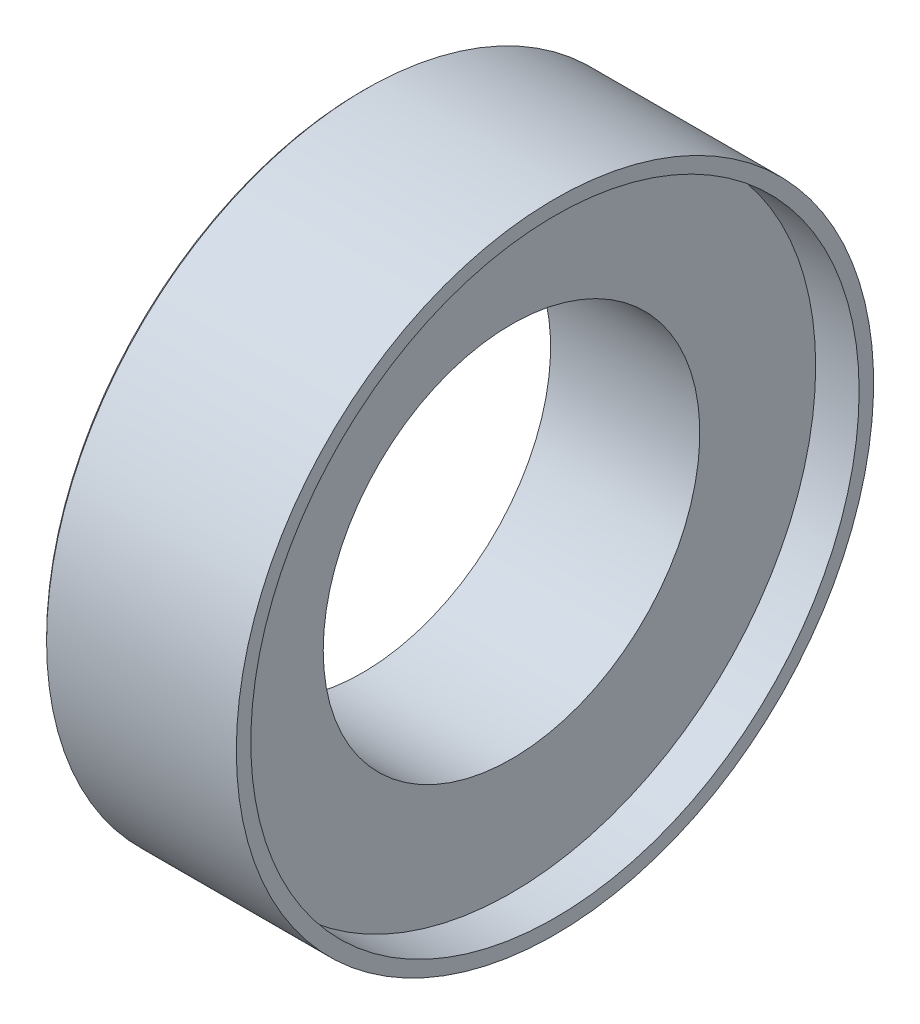
ISO-10303-21;
HEADER;
FILE_DESCRIPTION(('STEP AP214'),'2;1');
FILE_NAME('part.step','',(''),(''),'','','');
FILE_SCHEMA(('AUTOMOTIVE_DESIGN { 1 0 10303 214 1 1 1 1 }'));
ENDSEC;
DATA;
#1=APPLICATION_CONTEXT('core data for automotive mechanical design processes');
#2=APPLICATION_PROTOCOL_DEFINITION('international standard','automotive_design',2000,#1);
#3=PRODUCT_CONTEXT('',#1,'mechanical');
#4=PRODUCT('Part','Part','',(#3));
#5=PRODUCT_RELATED_PRODUCT_CATEGORY('part','',(#4));
#6=PRODUCT_DEFINITION_FORMATION('','',#4);
#7=PRODUCT_DEFINITION_CONTEXT('part definition',#1,'design');
#8=PRODUCT_DEFINITION('design','',#6,#7);
#9=PRODUCT_DEFINITION_SHAPE('','',#8);
#10=(LENGTH_UNIT() NAMED_UNIT(*) SI_UNIT(.MILLI.,.METRE.));
#11=(NAMED_UNIT(*) PLANE_ANGLE_UNIT() SI_UNIT($,.RADIAN.));
#12=(NAMED_UNIT(*) SI_UNIT($,.STERADIAN.) SOLID_ANGLE_UNIT());
#13=UNCERTAINTY_MEASURE_WITH_UNIT(LENGTH_MEASURE(1.E-05),#10,'distance_accuracy_value','');
#14=(GEOMETRIC_REPRESENTATION_CONTEXT(3) GLOBAL_UNCERTAINTY_ASSIGNED_CONTEXT((#13)) GLOBAL_UNIT_ASSIGNED_CONTEXT((#10,
#11,#12)) REPRESENTATION_CONTEXT('',''));
#15=CARTESIAN_POINT('',(0.,0.,0.));
#16=DIRECTION('',(0.,0.,1.));
#17=DIRECTION('',(1.,0.,0.));
#18=AXIS2_PLACEMENT_3D('',#15,#16,#17);
#19=CARTESIAN_POINT('',(27.9,0.,10.75));
#20=DIRECTION('',(1.,0.,0.));
#21=DIRECTION('',(0.,0.,-1.));
#22=AXIS2_PLACEMENT_3D('',#19,#20,#21);
#23=PLANE('',#22);
#24=CARTESIAN_POINT('',(27.9,0.,0.));
#25=DIRECTION('',(-1.,0.,0.));
#26=DIRECTION('',(0.,0.,1.));
#27=AXIS2_PLACEMENT_3D('',#24,#25,#26);
#28=CIRCLE('',#27,11.);
#29=CARTESIAN_POINT('',(27.9,0.,11.));
#30=VERTEX_POINT('',#29);
#31=EDGE_CURVE('E36',#30,#30,#28,.T.);
#32=ORIENTED_EDGE('',*,*,#31,.F.);
#33=EDGE_LOOP('',(#32));
#34=FACE_BOUND('',#33,.T.);
#35=CARTESIAN_POINT('',(27.9,0.,0.));
#36=DIRECTION('',(1.,0.,0.));
#37=DIRECTION('',(0.,0.,-1.));
#38=AXIS2_PLACEMENT_3D('',#35,#36,#37);
#39=CIRCLE('',#38,10.5);
#40=CARTESIAN_POINT('',(27.9,0.,-10.5));
#41=VERTEX_POINT('',#40);
#42=EDGE_CURVE('E18',#41,#41,#39,.F.);
#43=ORIENTED_EDGE('',*,*,#42,.T.);
#44=EDGE_LOOP('',(#43));
#45=FACE_BOUND('',#44,.T.);
#46=ADVANCED_FACE('F15',(#34,#45),#23,.T.);
#47=CARTESIAN_POINT('',(27.15,0.,0.));
#48=DIRECTION('',(1.,0.,0.));
#49=DIRECTION('',(0.,0.,-1.));
#50=AXIS2_PLACEMENT_3D('',#47,#48,#49);
#51=CYLINDRICAL_SURFACE('',#50,10.5);
#52=CARTESIAN_POINT('',(26.4,0.,0.));
#53=DIRECTION('',(1.,0.,0.));
#54=DIRECTION('',(0.,0.,-1.));
#55=AXIS2_PLACEMENT_3D('',#52,#53,#54);
#56=CIRCLE('',#55,10.5);
#57=CARTESIAN_POINT('',(26.4,0.,-10.5));
#58=VERTEX_POINT('',#57);
#59=EDGE_CURVE('E34',#58,#58,#56,.T.);
#60=ORIENTED_EDGE('',*,*,#59,.F.);
#61=EDGE_LOOP('',(#60));
#62=FACE_BOUND('',#61,.T.);
#63=ORIENTED_EDGE('',*,*,#42,.F.);
#64=EDGE_LOOP('',(#63));
#65=FACE_BOUND('',#64,.T.);
#66=ADVANCED_FACE('F44',(#62,#65),#51,.F.);
#67=CARTESIAN_POINT('',(23.825,0.,0.));
#68=DIRECTION('',(-1.,0.,0.));
#69=DIRECTION('',(0.,0.,1.));
#70=AXIS2_PLACEMENT_3D('',#67,#68,#69);
#71=CYLINDRICAL_SURFACE('',#70,11.);
#72=CARTESIAN_POINT('',(21.35,0.,0.));
#73=DIRECTION('',(1.,0.,0.));
#74=DIRECTION('',(0.,0.,1.));
#75=AXIS2_PLACEMENT_3D('',#72,#73,#74);
#76=CIRCLE('',#75,11.);
#77=CARTESIAN_POINT('',(21.35,0.,11.));
#78=VERTEX_POINT('',#77);
#79=EDGE_CURVE('E30',#78,#78,#76,.F.);
#80=ORIENTED_EDGE('',*,*,#79,.F.);
#81=EDGE_LOOP('',(#80));
#82=FACE_BOUND('',#81,.T.);
#83=ORIENTED_EDGE('',*,*,#31,.T.);
#84=EDGE_LOOP('',(#83));
#85=FACE_BOUND('',#84,.T.);
#86=ADVANCED_FACE('F46',(#82,#85),#71,.T.);
#87=CARTESIAN_POINT('',(26.4,0.,8.75));
#88=DIRECTION('',(1.,0.,0.));
#89=DIRECTION('',(0.,0.,-1.));
#90=AXIS2_PLACEMENT_3D('',#87,#88,#89);
#91=PLANE('',#90);
#92=CARTESIAN_POINT('',(26.4,0.,0.));
#93=DIRECTION('',(-1.,0.,0.));
#94=DIRECTION('',(0.,0.,1.));
#95=AXIS2_PLACEMENT_3D('',#92,#93,#94);
#96=CIRCLE('',#95,6.5);
#97=CARTESIAN_POINT('',(26.4,0.,6.5));
#98=VERTEX_POINT('',#97);
#99=EDGE_CURVE('E27',#98,#98,#96,.T.);
#100=ORIENTED_EDGE('',*,*,#99,.T.);
#101=EDGE_LOOP('',(#100));
#102=FACE_BOUND('',#101,.T.);
#103=ORIENTED_EDGE('',*,*,#59,.T.);
#104=EDGE_LOOP('',(#103));
#105=FACE_BOUND('',#104,.T.);
#106=ADVANCED_FACE('F53',(#102,#105),#91,.T.);
#107=CARTESIAN_POINT('',(21.35,0.,0.));
#108=DIRECTION('',(1.,0.,0.));
#109=DIRECTION('',(0.,0.,-1.));
#110=AXIS2_PLACEMENT_3D('',#107,#108,#109);
#111=CONICAL_SURFACE('',#110,11.,0.785398163397448);
#112=CARTESIAN_POINT('',(21.25,0.,0.));
#113=DIRECTION('',(1.,0.,0.));
#114=DIRECTION('',(0.,0.,-1.));
#115=AXIS2_PLACEMENT_3D('',#112,#113,#114);
#116=CIRCLE('',#115,10.9);
#117=CARTESIAN_POINT('',(21.25,0.,-10.9));
#118=VERTEX_POINT('',#117);
#119=EDGE_CURVE('E22',#118,#118,#116,.F.);
#120=ORIENTED_EDGE('',*,*,#119,.F.);
#121=EDGE_LOOP('',(#120));
#122=FACE_BOUND('',#121,.T.);
#123=ORIENTED_EDGE('',*,*,#79,.T.);
#124=EDGE_LOOP('',(#123));
#125=FACE_BOUND('',#124,.T.);
#126=ADVANCED_FACE('F65',(#122,#125),#111,.T.);
#127=CARTESIAN_POINT('',(23.825,0.,0.));
#128=DIRECTION('',(-1.,0.,0.));
#129=DIRECTION('',(0.,0.,1.));
#130=AXIS2_PLACEMENT_3D('',#127,#128,#129);
#131=CYLINDRICAL_SURFACE('',#130,6.5);
#132=ORIENTED_EDGE('',*,*,#99,.F.);
#133=EDGE_LOOP('',(#132));
#134=FACE_BOUND('',#133,.T.);
#135=CARTESIAN_POINT('',(21.25,0.,0.));
#136=DIRECTION('',(-1.,0.,0.));
#137=DIRECTION('',(0.,0.,1.));
#138=AXIS2_PLACEMENT_3D('',#135,#136,#137);
#139=CIRCLE('',#138,6.5);
#140=CARTESIAN_POINT('',(21.25,0.,6.5));
#141=VERTEX_POINT('',#140);
#142=EDGE_CURVE('E10',#141,#141,#139,.F.);
#143=ORIENTED_EDGE('',*,*,#142,.F.);
#144=EDGE_LOOP('',(#143));
#145=FACE_BOUND('',#144,.T.);
#146=ADVANCED_FACE('F60',(#134,#145),#131,.F.);
#147=CARTESIAN_POINT('',(21.25,0.,8.75));
#148=DIRECTION('',(-1.,0.,0.));
#149=DIRECTION('',(0.,0.,1.));
#150=AXIS2_PLACEMENT_3D('',#147,#148,#149);
#151=PLANE('',#150);
#152=ORIENTED_EDGE('',*,*,#142,.T.);
#153=EDGE_LOOP('',(#152));
#154=FACE_BOUND('',#153,.T.);
#155=ORIENTED_EDGE('',*,*,#119,.T.);
#156=EDGE_LOOP('',(#155));
#157=FACE_BOUND('',#156,.T.);
#158=ADVANCED_FACE('F58',(#154,#157),#151,.T.);
#159=CLOSED_SHELL('',(#46,#66,#86,#106,#126,#146,#158));
#160=MANIFOLD_SOLID_BREP('B1',#159);
#161=ADVANCED_BREP_SHAPE_REPRESENTATION('',(#18,#160),#14);
#162=SHAPE_DEFINITION_REPRESENTATION(#9,#161);
ENDSEC;
END-ISO-10303-21;
